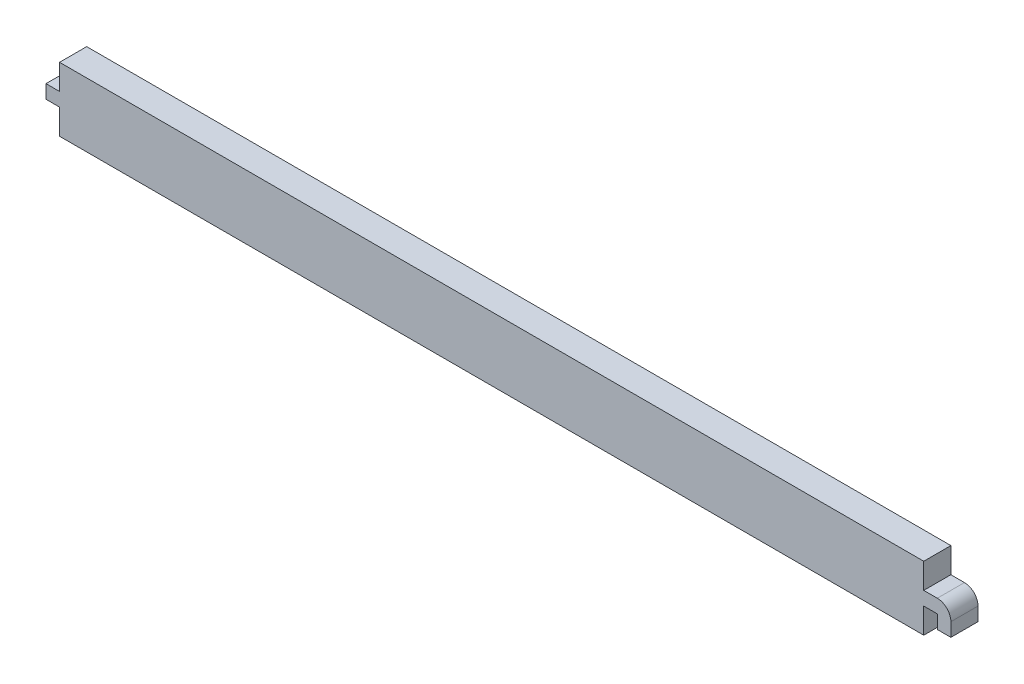
ISO-10303-21;
HEADER;
FILE_DESCRIPTION(('STEP AP214'),'2;1');
FILE_NAME('part.step','',(''),(''),'','','');
FILE_SCHEMA(('AUTOMOTIVE_DESIGN { 1 0 10303 214 1 1 1 1 }'));
ENDSEC;
DATA;
#1=APPLICATION_CONTEXT('core data for automotive mechanical design processes');
#2=APPLICATION_PROTOCOL_DEFINITION('international standard','automotive_design',2000,#1);
#3=PRODUCT_CONTEXT('',#1,'mechanical');
#4=PRODUCT('Part','Part','',(#3));
#5=PRODUCT_RELATED_PRODUCT_CATEGORY('part','',(#4));
#6=PRODUCT_DEFINITION_FORMATION('','',#4);
#7=PRODUCT_DEFINITION_CONTEXT('part definition',#1,'design');
#8=PRODUCT_DEFINITION('design','',#6,#7);
#9=PRODUCT_DEFINITION_SHAPE('','',#8);
#10=(LENGTH_UNIT() NAMED_UNIT(*) SI_UNIT(.MILLI.,.METRE.));
#11=(NAMED_UNIT(*) PLANE_ANGLE_UNIT() SI_UNIT($,.RADIAN.));
#12=(NAMED_UNIT(*) SI_UNIT($,.STERADIAN.) SOLID_ANGLE_UNIT());
#13=UNCERTAINTY_MEASURE_WITH_UNIT(LENGTH_MEASURE(1.E-05),#10,'distance_accuracy_value','');
#14=(GEOMETRIC_REPRESENTATION_CONTEXT(3) GLOBAL_UNCERTAINTY_ASSIGNED_CONTEXT((#13)) GLOBAL_UNIT_ASSIGNED_CONTEXT((#10,
#11,#12)) REPRESENTATION_CONTEXT('',''));
#15=CARTESIAN_POINT('',(0.,0.,0.));
#16=DIRECTION('',(0.,0.,1.));
#17=DIRECTION('',(1.,0.,0.));
#18=AXIS2_PLACEMENT_3D('',#15,#16,#17);
#19=CARTESIAN_POINT('',(202.3,0.,6.35));
#20=DIRECTION('',(-1.,0.,0.));
#21=DIRECTION('',(0.,-1.,0.));
#22=AXIS2_PLACEMENT_3D('',#19,#20,#21);
#23=PLANE('',#22);
#24=DIRECTION('',(0.,0.,1.));
#25=VECTOR('',#24,1.);
#26=CARTESIAN_POINT('',(202.3,9.08749999999982,-8.98025612106914));
#27=LINE('',#26,#25);
#28=CARTESIAN_POINT('',(202.3,9.08749999999982,0.));
#29=VERTEX_POINT('',#28);
#30=CARTESIAN_POINT('',(202.3,9.08749999999982,6.35));
#31=VERTEX_POINT('',#30);
#32=EDGE_CURVE('E67',#29,#31,#27,.T.);
#33=ORIENTED_EDGE('',*,*,#32,.F.);
#34=DIRECTION('',(0.,1.,0.));
#35=VECTOR('',#34,1.);
#36=CARTESIAN_POINT('',(202.3,0.,0.));
#37=LINE('',#36,#35);
#38=CARTESIAN_POINT('',(202.3,15.,0.));
#39=VERTEX_POINT('',#38);
#40=EDGE_CURVE('E157',#29,#39,#37,.T.);
#41=ORIENTED_EDGE('',*,*,#40,.T.);
#42=DIRECTION('',(0.,0.,-1.));
#43=VECTOR('',#42,1.);
#44=CARTESIAN_POINT('',(202.3,15.,6.35));
#45=LINE('',#44,#43);
#46=CARTESIAN_POINT('',(202.3,15.,6.35));
#47=VERTEX_POINT('',#46);
#48=EDGE_CURVE('E256',#47,#39,#45,.T.);
#49=ORIENTED_EDGE('',*,*,#48,.F.);
#50=DIRECTION('',(0.,1.,0.));
#51=VECTOR('',#50,1.);
#52=CARTESIAN_POINT('',(202.3,0.,6.35));
#53=LINE('',#52,#51);
#54=EDGE_CURVE('E242',#31,#47,#53,.T.);
#55=ORIENTED_EDGE('',*,*,#54,.F.);
#56=EDGE_LOOP('',(#33,#41,#49,#55));
#57=FACE_BOUND('',#56,.T.);
#58=ADVANCED_FACE('F42',(#57),#23,.F.);
#59=CARTESIAN_POINT('',(0.,0.,6.35));
#60=DIRECTION('',(-1.,0.,0.));
#61=DIRECTION('',(0.,0.,1.));
#62=AXIS2_PLACEMENT_3D('',#59,#60,#61);
#63=PLANE('',#62);
#64=DIRECTION('',(0.,1.,0.));
#65=VECTOR('',#64,1.);
#66=CARTESIAN_POINT('',(0.,0.,0.));
#67=LINE('',#66,#65);
#68=CARTESIAN_POINT('',(0.,9.08750000000001,0.));
#69=VERTEX_POINT('',#68);
#70=CARTESIAN_POINT('',(0.,15.,0.));
#71=VERTEX_POINT('',#70);
#72=EDGE_CURVE('E234',#69,#71,#67,.T.);
#73=ORIENTED_EDGE('',*,*,#72,.F.);
#74=DIRECTION('',(0.,0.,1.));
#75=VECTOR('',#74,1.);
#76=CARTESIAN_POINT('',(0.,9.08750000000001,-8.98025612106914));
#77=LINE('',#76,#75);
#78=CARTESIAN_POINT('',(0.,9.08750000000001,6.35));
#79=VERTEX_POINT('',#78);
#80=EDGE_CURVE('E229',#69,#79,#77,.T.);
#81=ORIENTED_EDGE('',*,*,#80,.T.);
#82=DIRECTION('',(0.,1.,0.));
#83=VECTOR('',#82,1.);
#84=CARTESIAN_POINT('',(0.,0.,6.35));
#85=LINE('',#84,#83);
#86=CARTESIAN_POINT('',(0.,15.,6.35));
#87=VERTEX_POINT('',#86);
#88=EDGE_CURVE('E239',#79,#87,#85,.T.);
#89=ORIENTED_EDGE('',*,*,#88,.T.);
#90=DIRECTION('',(0.,0.,-1.));
#91=VECTOR('',#90,1.);
#92=CARTESIAN_POINT('',(0.,15.,6.35));
#93=LINE('',#92,#91);
#94=EDGE_CURVE('E46',#87,#71,#93,.T.);
#95=ORIENTED_EDGE('',*,*,#94,.T.);
#96=EDGE_LOOP('',(#73,#81,#89,#95));
#97=FACE_BOUND('',#96,.T.);
#98=ADVANCED_FACE('F265',(#97),#63,.T.);
#99=DIRECTION('',(0.,0.,1.));
#100=VECTOR('',#99,1.);
#101=CARTESIAN_POINT('',(0.,5.91250000000001,-8.98025612106914));
#102=LINE('',#101,#100);
#103=CARTESIAN_POINT('',(0.,5.91250000000001,0.));
#104=VERTEX_POINT('',#103);
#105=CARTESIAN_POINT('',(0.,5.91250000000001,6.35));
#106=VERTEX_POINT('',#105);
#107=EDGE_CURVE('E223',#104,#106,#102,.T.);
#108=ORIENTED_EDGE('',*,*,#107,.F.);
#109=CARTESIAN_POINT('',(0.,0.,0.));
#110=VERTEX_POINT('',#109);
#111=EDGE_CURVE('E247',#110,#104,#67,.T.);
#112=ORIENTED_EDGE('',*,*,#111,.F.);
#113=DIRECTION('',(0.,0.,-1.));
#114=VECTOR('',#113,1.);
#115=CARTESIAN_POINT('',(0.,0.,6.35));
#116=LINE('',#115,#114);
#117=CARTESIAN_POINT('',(0.,0.,6.35));
#118=VERTEX_POINT('',#117);
#119=EDGE_CURVE('E11',#118,#110,#116,.T.);
#120=ORIENTED_EDGE('',*,*,#119,.F.);
#121=EDGE_CURVE('E235',#118,#106,#85,.T.);
#122=ORIENTED_EDGE('',*,*,#121,.T.);
#123=EDGE_LOOP('',(#108,#112,#120,#122));
#124=FACE_BOUND('',#123,.T.);
#125=ADVANCED_FACE('F44',(#124),#63,.T.);
#126=CARTESIAN_POINT('',(0.,0.,6.35));
#127=DIRECTION('',(0.,1.,0.));
#128=DIRECTION('',(0.,0.,1.));
#129=AXIS2_PLACEMENT_3D('',#126,#127,#128);
#130=PLANE('',#129);
#131=DIRECTION('',(1.,0.,0.));
#132=VECTOR('',#131,1.);
#133=CARTESIAN_POINT('',(0.,0.,0.));
#134=LINE('',#133,#132);
#135=CARTESIAN_POINT('',(202.3,0.,0.));
#136=VERTEX_POINT('',#135);
#137=EDGE_CURVE('E253',#110,#136,#134,.T.);
#138=ORIENTED_EDGE('',*,*,#137,.T.);
#139=DIRECTION('',(0.,0.,-1.));
#140=VECTOR('',#139,1.);
#141=CARTESIAN_POINT('',(202.3,0.,6.35));
#142=LINE('',#141,#140);
#143=CARTESIAN_POINT('',(202.3,0.,6.35));
#144=VERTEX_POINT('',#143);
#145=EDGE_CURVE('E51',#144,#136,#142,.T.);
#146=ORIENTED_EDGE('',*,*,#145,.F.);
#147=DIRECTION('',(1.,0.,0.));
#148=VECTOR('',#147,1.);
#149=CARTESIAN_POINT('',(0.,0.,6.35));
#150=LINE('',#149,#148);
#151=EDGE_CURVE('E245',#118,#144,#150,.T.);
#152=ORIENTED_EDGE('',*,*,#151,.F.);
#153=ORIENTED_EDGE('',*,*,#119,.T.);
#154=EDGE_LOOP('',(#138,#146,#152,#153));
#155=FACE_BOUND('',#154,.T.);
#156=ADVANCED_FACE('F285',(#155),#130,.F.);
#157=CARTESIAN_POINT('',(202.3,5.91249999999982,0.));
#158=VERTEX_POINT('',#157);
#159=EDGE_CURVE('E251',#136,#158,#37,.T.);
#160=ORIENTED_EDGE('',*,*,#159,.T.);
#161=DIRECTION('',(0.,0.,1.));
#162=VECTOR('',#161,1.);
#163=CARTESIAN_POINT('',(202.3,5.91249999999982,-8.98025612106914));
#164=LINE('',#163,#162);
#165=CARTESIAN_POINT('',(202.3,5.91249999999982,6.35));
#166=VERTEX_POINT('',#165);
#167=EDGE_CURVE('E59',#158,#166,#164,.T.);
#168=ORIENTED_EDGE('',*,*,#167,.T.);
#169=EDGE_CURVE('E243',#144,#166,#53,.T.);
#170=ORIENTED_EDGE('',*,*,#169,.F.);
#171=ORIENTED_EDGE('',*,*,#145,.T.);
#172=EDGE_LOOP('',(#160,#168,#170,#171));
#173=FACE_BOUND('',#172,.T.);
#174=ADVANCED_FACE('F278',(#173),#23,.F.);
#175=CARTESIAN_POINT('',(0.,15.,6.35));
#176=DIRECTION('',(0.,1.,0.));
#177=DIRECTION('',(0.,0.,1.));
#178=AXIS2_PLACEMENT_3D('',#175,#176,#177);
#179=PLANE('',#178);
#180=DIRECTION('',(1.,0.,0.));
#181=VECTOR('',#180,1.);
#182=CARTESIAN_POINT('',(0.,15.,0.));
#183=LINE('',#182,#181);
#184=EDGE_CURVE('E249',#71,#39,#183,.T.);
#185=ORIENTED_EDGE('',*,*,#184,.F.);
#186=ORIENTED_EDGE('',*,*,#94,.F.);
#187=DIRECTION('',(1.,0.,0.));
#188=VECTOR('',#187,1.);
#189=CARTESIAN_POINT('',(0.,15.,6.35));
#190=LINE('',#189,#188);
#191=EDGE_CURVE('E238',#87,#47,#190,.T.);
#192=ORIENTED_EDGE('',*,*,#191,.T.);
#193=ORIENTED_EDGE('',*,*,#48,.T.);
#194=EDGE_LOOP('',(#185,#186,#192,#193));
#195=FACE_BOUND('',#194,.T.);
#196=ADVANCED_FACE('F268',(#195),#179,.T.);
#197=CARTESIAN_POINT('',(0.,0.,6.35));
#198=DIRECTION('',(0.,0.,-1.));
#199=DIRECTION('',(-1.,0.,0.));
#200=AXIS2_PLACEMENT_3D('',#197,#198,#199);
#201=PLANE('',#200);
#202=ORIENTED_EDGE('',*,*,#121,.F.);
#203=ORIENTED_EDGE('',*,*,#151,.T.);
#204=ORIENTED_EDGE('',*,*,#169,.T.);
#205=DIRECTION('',(-1.,0.,0.));
#206=VECTOR('',#205,1.);
#207=CARTESIAN_POINT('',(205.475,5.91249999999984,6.35));
#208=LINE('',#207,#206);
#209=CARTESIAN_POINT('',(205.475,5.91249999999984,6.35));
#210=VERTEX_POINT('',#209);
#211=EDGE_CURVE('E186',#210,#166,#208,.T.);
#212=ORIENTED_EDGE('',*,*,#211,.F.);
#213=DIRECTION('',(0.,1.,0.));
#214=VECTOR('',#213,1.);
#215=CARTESIAN_POINT('',(205.475,2.73749999999983,6.35));
#216=LINE('',#215,#214);
#217=CARTESIAN_POINT('',(205.475,2.73749999999983,6.35));
#218=VERTEX_POINT('',#217);
#219=EDGE_CURVE('E189',#218,#210,#216,.T.);
#220=ORIENTED_EDGE('',*,*,#219,.F.);
#221=DIRECTION('',(-1.,0.,0.));
#222=VECTOR('',#221,1.);
#223=CARTESIAN_POINT('',(208.65,2.73749999999983,6.35));
#224=LINE('',#223,#222);
#225=CARTESIAN_POINT('',(208.65,2.73749999999983,6.35));
#226=VERTEX_POINT('',#225);
#227=EDGE_CURVE('E192',#226,#218,#224,.T.);
#228=ORIENTED_EDGE('',*,*,#227,.F.);
#229=DIRECTION('',(0.,-1.,0.));
#230=VECTOR('',#229,1.);
#231=CARTESIAN_POINT('',(208.65,5.91249999999983,6.35));
#232=LINE('',#231,#230);
#233=CARTESIAN_POINT('',(208.65,5.91249999999983,6.35));
#234=VERTEX_POINT('',#233);
#235=EDGE_CURVE('E175',#234,#226,#232,.T.);
#236=ORIENTED_EDGE('',*,*,#235,.F.);
#237=CARTESIAN_POINT('',(205.475,5.91249999999984,6.35));
#238=DIRECTION('',(0.,0.,-1.));
#239=DIRECTION('',(-1.,0.,0.));
#240=AXIS2_PLACEMENT_3D('',#237,#238,#239);
#241=CIRCLE('',#240,3.17499999999998);
#242=CARTESIAN_POINT('',(205.475,9.08749999999981,6.35));
#243=VERTEX_POINT('',#242);
#244=EDGE_CURVE('E176',#243,#234,#241,.T.);
#245=ORIENTED_EDGE('',*,*,#244,.F.);
#246=DIRECTION('',(-1.,0.,0.));
#247=VECTOR('',#246,1.);
#248=CARTESIAN_POINT('',(205.475,9.08749999999981,6.35));
#249=LINE('',#248,#247);
#250=EDGE_CURVE('E160',#243,#31,#249,.T.);
#251=ORIENTED_EDGE('',*,*,#250,.T.);
#252=ORIENTED_EDGE('',*,*,#54,.T.);
#253=ORIENTED_EDGE('',*,*,#191,.F.);
#254=ORIENTED_EDGE('',*,*,#88,.F.);
#255=DIRECTION('',(-1.,0.,0.));
#256=VECTOR('',#255,1.);
#257=CARTESIAN_POINT('',(0.,9.08750000000001,6.35));
#258=LINE('',#257,#256);
#259=CARTESIAN_POINT('',(-3.175,9.08750000000001,6.35));
#260=VERTEX_POINT('',#259);
#261=EDGE_CURVE('E169',#79,#260,#258,.T.);
#262=ORIENTED_EDGE('',*,*,#261,.T.);
#263=DIRECTION('',(0.,-1.,0.));
#264=VECTOR('',#263,1.);
#265=CARTESIAN_POINT('',(-3.175,9.08750000000001,6.35));
#266=LINE('',#265,#264);
#267=CARTESIAN_POINT('',(-3.175,5.91250000000001,6.35));
#268=VERTEX_POINT('',#267);
#269=EDGE_CURVE('E213',#260,#268,#266,.T.);
#270=ORIENTED_EDGE('',*,*,#269,.T.);
#271=DIRECTION('',(1.,0.,0.));
#272=VECTOR('',#271,1.);
#273=CARTESIAN_POINT('',(-3.175,5.91250000000001,6.35));
#274=LINE('',#273,#272);
#275=EDGE_CURVE('E209',#268,#106,#274,.T.);
#276=ORIENTED_EDGE('',*,*,#275,.T.);
#277=EDGE_LOOP('',(#202,#203,#204,#212,#220,#228,#236,#245,#251,#252,#253,#254,#262,#270,#276));
#278=FACE_BOUND('',#277,.T.);
#279=ADVANCED_FACE('F275',(#278),#201,.F.);
#280=CARTESIAN_POINT('',(0.,0.,0.));
#281=DIRECTION('',(0.,0.,-1.));
#282=DIRECTION('',(-1.,0.,0.));
#283=AXIS2_PLACEMENT_3D('',#280,#281,#282);
#284=PLANE('',#283);
#285=ORIENTED_EDGE('',*,*,#111,.T.);
#286=DIRECTION('',(1.,0.,0.));
#287=VECTOR('',#286,1.);
#288=CARTESIAN_POINT('',(-3.175,5.91250000000001,0.));
#289=LINE('',#288,#287);
#290=CARTESIAN_POINT('',(-3.175,5.91250000000001,0.));
#291=VERTEX_POINT('',#290);
#292=EDGE_CURVE('E221',#291,#104,#289,.T.);
#293=ORIENTED_EDGE('',*,*,#292,.F.);
#294=DIRECTION('',(0.,-1.,0.));
#295=VECTOR('',#294,1.);
#296=CARTESIAN_POINT('',(-3.175,9.08750000000001,0.));
#297=LINE('',#296,#295);
#298=CARTESIAN_POINT('',(-3.175,9.08750000000001,0.));
#299=VERTEX_POINT('',#298);
#300=EDGE_CURVE('E225',#299,#291,#297,.T.);
#301=ORIENTED_EDGE('',*,*,#300,.F.);
#302=DIRECTION('',(-1.,0.,0.));
#303=VECTOR('',#302,1.);
#304=CARTESIAN_POINT('',(0.,9.08750000000001,0.));
#305=LINE('',#304,#303);
#306=EDGE_CURVE('E212',#69,#299,#305,.T.);
#307=ORIENTED_EDGE('',*,*,#306,.F.);
#308=ORIENTED_EDGE('',*,*,#72,.T.);
#309=ORIENTED_EDGE('',*,*,#184,.T.);
#310=ORIENTED_EDGE('',*,*,#40,.F.);
#311=DIRECTION('',(-1.,0.,0.));
#312=VECTOR('',#311,1.);
#313=CARTESIAN_POINT('',(205.475,9.08749999999981,0.));
#314=LINE('',#313,#312);
#315=CARTESIAN_POINT('',(205.475,9.08749999999981,0.));
#316=VERTEX_POINT('',#315);
#317=EDGE_CURVE('E150',#316,#29,#314,.T.);
#318=ORIENTED_EDGE('',*,*,#317,.F.);
#319=CARTESIAN_POINT('',(205.475,5.91249999999984,0.));
#320=DIRECTION('',(0.,0.,-1.));
#321=DIRECTION('',(-1.,0.,0.));
#322=AXIS2_PLACEMENT_3D('',#319,#320,#321);
#323=CIRCLE('',#322,3.17499999999998);
#324=CARTESIAN_POINT('',(208.65,5.91249999999983,0.));
#325=VERTEX_POINT('',#324);
#326=EDGE_CURVE('E154',#316,#325,#323,.T.);
#327=ORIENTED_EDGE('',*,*,#326,.T.);
#328=DIRECTION('',(0.,-1.,0.));
#329=VECTOR('',#328,1.);
#330=CARTESIAN_POINT('',(208.65,5.91249999999983,0.));
#331=LINE('',#330,#329);
#332=CARTESIAN_POINT('',(208.65,2.73749999999983,0.));
#333=VERTEX_POINT('',#332);
#334=EDGE_CURVE('E170',#325,#333,#331,.T.);
#335=ORIENTED_EDGE('',*,*,#334,.T.);
#336=DIRECTION('',(-1.,0.,0.));
#337=VECTOR('',#336,1.);
#338=CARTESIAN_POINT('',(208.65,2.73749999999983,0.));
#339=LINE('',#338,#337);
#340=CARTESIAN_POINT('',(205.475,2.73749999999983,0.));
#341=VERTEX_POINT('',#340);
#342=EDGE_CURVE('E199',#333,#341,#339,.T.);
#343=ORIENTED_EDGE('',*,*,#342,.T.);
#344=DIRECTION('',(0.,1.,0.));
#345=VECTOR('',#344,1.);
#346=CARTESIAN_POINT('',(205.475,2.73749999999983,0.));
#347=LINE('',#346,#345);
#348=CARTESIAN_POINT('',(205.475,5.91249999999984,0.));
#349=VERTEX_POINT('',#348);
#350=EDGE_CURVE('E197',#341,#349,#347,.T.);
#351=ORIENTED_EDGE('',*,*,#350,.T.);
#352=DIRECTION('',(-1.,0.,0.));
#353=VECTOR('',#352,1.);
#354=CARTESIAN_POINT('',(205.475,5.91249999999984,0.));
#355=LINE('',#354,#353);
#356=EDGE_CURVE('E194',#349,#158,#355,.T.);
#357=ORIENTED_EDGE('',*,*,#356,.T.);
#358=ORIENTED_EDGE('',*,*,#159,.F.);
#359=ORIENTED_EDGE('',*,*,#137,.F.);
#360=EDGE_LOOP('',(#285,#293,#301,#307,#308,#309,#310,#318,#327,#335,#343,#351,#357,#358,#359));
#361=FACE_BOUND('',#360,.T.);
#362=ADVANCED_FACE('F153',(#361),#284,.T.);
#363=CARTESIAN_POINT('',(0.,9.08750000000001,-8.98025612106914));
#364=DIRECTION('',(0.,1.,0.));
#365=DIRECTION('',(0.,0.,1.));
#366=AXIS2_PLACEMENT_3D('',#363,#364,#365);
#367=PLANE('',#366);
#368=ORIENTED_EDGE('',*,*,#80,.F.);
#369=ORIENTED_EDGE('',*,*,#306,.T.);
#370=DIRECTION('',(0.,0.,1.));
#371=VECTOR('',#370,1.);
#372=CARTESIAN_POINT('',(-3.175,9.08750000000001,-8.98025612106914));
#373=LINE('',#372,#371);
#374=EDGE_CURVE('E220',#299,#260,#373,.T.);
#375=ORIENTED_EDGE('',*,*,#374,.T.);
#376=ORIENTED_EDGE('',*,*,#261,.F.);
#377=EDGE_LOOP('',(#368,#369,#375,#376));
#378=FACE_BOUND('',#377,.T.);
#379=ADVANCED_FACE('F272',(#378),#367,.T.);
#380=CARTESIAN_POINT('',(-3.175,9.08750000000001,-8.98025612106914));
#381=DIRECTION('',(-1.,0.,0.));
#382=DIRECTION('',(0.,-1.,0.));
#383=AXIS2_PLACEMENT_3D('',#380,#381,#382);
#384=PLANE('',#383);
#385=ORIENTED_EDGE('',*,*,#374,.F.);
#386=ORIENTED_EDGE('',*,*,#300,.T.);
#387=DIRECTION('',(0.,0.,1.));
#388=VECTOR('',#387,1.);
#389=CARTESIAN_POINT('',(-3.175,5.91250000000001,-8.98025612106914));
#390=LINE('',#389,#388);
#391=EDGE_CURVE('E224',#291,#268,#390,.T.);
#392=ORIENTED_EDGE('',*,*,#391,.T.);
#393=ORIENTED_EDGE('',*,*,#269,.F.);
#394=EDGE_LOOP('',(#385,#386,#392,#393));
#395=FACE_BOUND('',#394,.T.);
#396=ADVANCED_FACE('F314',(#395),#384,.T.);
#397=CARTESIAN_POINT('',(-3.175,5.91250000000001,-8.98025612106914));
#398=DIRECTION('',(0.,-1.,0.));
#399=DIRECTION('',(0.,0.,-1.));
#400=AXIS2_PLACEMENT_3D('',#397,#398,#399);
#401=PLANE('',#400);
#402=ORIENTED_EDGE('',*,*,#391,.F.);
#403=ORIENTED_EDGE('',*,*,#292,.T.);
#404=ORIENTED_EDGE('',*,*,#107,.T.);
#405=ORIENTED_EDGE('',*,*,#275,.F.);
#406=EDGE_LOOP('',(#402,#403,#404,#405));
#407=FACE_BOUND('',#406,.T.);
#408=ADVANCED_FACE('F311',(#407),#401,.T.);
#409=CARTESIAN_POINT('',(205.475,9.08749999999981,-8.98025612106914));
#410=DIRECTION('',(0.,1.,0.));
#411=DIRECTION('',(-1.,0.,0.));
#412=AXIS2_PLACEMENT_3D('',#409,#410,#411);
#413=PLANE('',#412);
#414=DIRECTION('',(0.,0.,1.));
#415=VECTOR('',#414,1.);
#416=CARTESIAN_POINT('',(205.475,9.08749999999981,-8.98025612106914));
#417=LINE('',#416,#415);
#418=EDGE_CURVE('E165',#316,#243,#417,.T.);
#419=ORIENTED_EDGE('',*,*,#418,.F.);
#420=ORIENTED_EDGE('',*,*,#317,.T.);
#421=ORIENTED_EDGE('',*,*,#32,.T.);
#422=ORIENTED_EDGE('',*,*,#250,.F.);
#423=EDGE_LOOP('',(#419,#420,#421,#422));
#424=FACE_BOUND('',#423,.T.);
#425=ADVANCED_FACE('F173',(#424),#413,.T.);
#426=CARTESIAN_POINT('',(205.475,5.91249999999984,-8.98025612106914));
#427=DIRECTION('',(0.,1.,0.));
#428=DIRECTION('',(-1.,0.,0.));
#429=AXIS2_PLACEMENT_3D('',#426,#427,#428);
#430=PLANE('',#429);
#431=ORIENTED_EDGE('',*,*,#356,.F.);
#432=DIRECTION('',(0.,0.,1.));
#433=VECTOR('',#432,1.);
#434=CARTESIAN_POINT('',(205.475,5.91249999999984,-8.98025612106914));
#435=LINE('',#434,#433);
#436=EDGE_CURVE('E184',#349,#210,#435,.T.);
#437=ORIENTED_EDGE('',*,*,#436,.T.);
#438=ORIENTED_EDGE('',*,*,#211,.T.);
#439=ORIENTED_EDGE('',*,*,#167,.F.);
#440=EDGE_LOOP('',(#431,#437,#438,#439));
#441=FACE_BOUND('',#440,.T.);
#442=ADVANCED_FACE('F300',(#441),#430,.F.);
#443=CARTESIAN_POINT('',(205.475,2.73749999999983,-8.98025612106914));
#444=DIRECTION('',(1.,0.,0.));
#445=DIRECTION('',(0.,0.,-1.));
#446=AXIS2_PLACEMENT_3D('',#443,#444,#445);
#447=PLANE('',#446);
#448=ORIENTED_EDGE('',*,*,#350,.F.);
#449=DIRECTION('',(0.,0.,1.));
#450=VECTOR('',#449,1.);
#451=CARTESIAN_POINT('',(205.475,2.73749999999983,-8.98025612106914));
#452=LINE('',#451,#450);
#453=EDGE_CURVE('E187',#341,#218,#452,.T.);
#454=ORIENTED_EDGE('',*,*,#453,.T.);
#455=ORIENTED_EDGE('',*,*,#219,.T.);
#456=ORIENTED_EDGE('',*,*,#436,.F.);
#457=EDGE_LOOP('',(#448,#454,#455,#456));
#458=FACE_BOUND('',#457,.T.);
#459=ADVANCED_FACE('F367',(#458),#447,.F.);
#460=CARTESIAN_POINT('',(208.65,2.73749999999983,-8.98025612106914));
#461=DIRECTION('',(0.,1.,0.));
#462=DIRECTION('',(-1.,0.,0.));
#463=AXIS2_PLACEMENT_3D('',#460,#461,#462);
#464=PLANE('',#463);
#465=ORIENTED_EDGE('',*,*,#342,.F.);
#466=DIRECTION('',(0.,0.,1.));
#467=VECTOR('',#466,1.);
#468=CARTESIAN_POINT('',(208.65,2.73749999999983,-8.98025612106914));
#469=LINE('',#468,#467);
#470=EDGE_CURVE('E190',#333,#226,#469,.T.);
#471=ORIENTED_EDGE('',*,*,#470,.T.);
#472=ORIENTED_EDGE('',*,*,#227,.T.);
#473=ORIENTED_EDGE('',*,*,#453,.F.);
#474=EDGE_LOOP('',(#465,#471,#472,#473));
#475=FACE_BOUND('',#474,.T.);
#476=ADVANCED_FACE('F377',(#475),#464,.F.);
#477=CARTESIAN_POINT('',(208.65,5.91249999999983,-8.98025612106914));
#478=DIRECTION('',(-1.,0.,0.));
#479=DIRECTION('',(0.,0.,1.));
#480=AXIS2_PLACEMENT_3D('',#477,#478,#479);
#481=PLANE('',#480);
#482=ORIENTED_EDGE('',*,*,#334,.F.);
#483=DIRECTION('',(0.,0.,1.));
#484=VECTOR('',#483,1.);
#485=CARTESIAN_POINT('',(208.65,5.91249999999983,-8.98025612106914));
#486=LINE('',#485,#484);
#487=EDGE_CURVE('E167',#325,#234,#486,.T.);
#488=ORIENTED_EDGE('',*,*,#487,.T.);
#489=ORIENTED_EDGE('',*,*,#235,.T.);
#490=ORIENTED_EDGE('',*,*,#470,.F.);
#491=EDGE_LOOP('',(#482,#488,#489,#490));
#492=FACE_BOUND('',#491,.T.);
#493=ADVANCED_FACE('F388',(#492),#481,.F.);
#494=CARTESIAN_POINT('',(205.475,5.91249999999984,-8.98025612106914));
#495=DIRECTION('',(0.,0.,1.));
#496=DIRECTION('',(1.,0.,0.));
#497=AXIS2_PLACEMENT_3D('',#494,#495,#496);
#498=CYLINDRICAL_SURFACE('',#497,3.17499999999998);
#499=ORIENTED_EDGE('',*,*,#326,.F.);
#500=ORIENTED_EDGE('',*,*,#418,.T.);
#501=ORIENTED_EDGE('',*,*,#244,.T.);
#502=ORIENTED_EDGE('',*,*,#487,.F.);
#503=EDGE_LOOP('',(#499,#500,#501,#502));
#504=FACE_BOUND('',#503,.T.);
#505=ADVANCED_FACE('F163',(#504),#498,.T.);
#506=CLOSED_SHELL('',(#58,#98,#125,#156,#174,#196,#279,#362,#379,#396,#408,#425,#442,#459,#476,
#493,#505));
#507=MANIFOLD_SOLID_BREP('B2',#506);
#508=ADVANCED_BREP_SHAPE_REPRESENTATION('',(#18,#507),#14);
#509=SHAPE_DEFINITION_REPRESENTATION(#9,#508);
ENDSEC;
END-ISO-10303-21;
